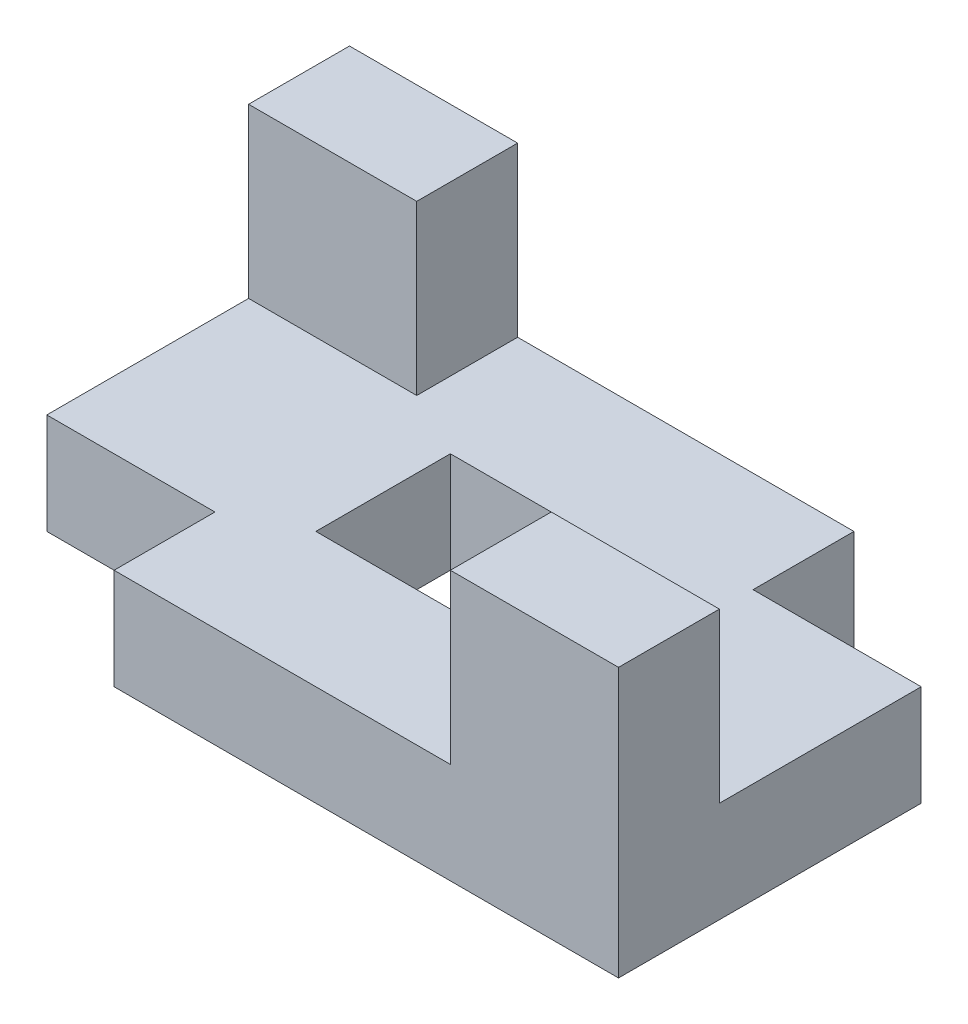
ISO-10303-21;
HEADER;
FILE_DESCRIPTION(('STEP AP214'),'2;1');
FILE_NAME('part.step','',(''),(''),'','','');
FILE_SCHEMA(('AUTOMOTIVE_DESIGN { 1 0 10303 214 1 1 1 1 }'));
ENDSEC;
DATA;
#1=APPLICATION_CONTEXT('core data for automotive mechanical design processes');
#2=APPLICATION_PROTOCOL_DEFINITION('international standard','automotive_design',2000,#1);
#3=PRODUCT_CONTEXT('',#1,'mechanical');
#4=PRODUCT('Part','Part','',(#3));
#5=PRODUCT_RELATED_PRODUCT_CATEGORY('part','',(#4));
#6=PRODUCT_DEFINITION_FORMATION('','',#4);
#7=PRODUCT_DEFINITION_CONTEXT('part definition',#1,'design');
#8=PRODUCT_DEFINITION('design','',#6,#7);
#9=PRODUCT_DEFINITION_SHAPE('','',#8);
#10=(LENGTH_UNIT() NAMED_UNIT(*) SI_UNIT(.MILLI.,.METRE.));
#11=(NAMED_UNIT(*) PLANE_ANGLE_UNIT() SI_UNIT($,.RADIAN.));
#12=(NAMED_UNIT(*) SI_UNIT($,.STERADIAN.) SOLID_ANGLE_UNIT());
#13=UNCERTAINTY_MEASURE_WITH_UNIT(LENGTH_MEASURE(1.E-05),#10,'distance_accuracy_value','');
#14=(GEOMETRIC_REPRESENTATION_CONTEXT(3) GLOBAL_UNCERTAINTY_ASSIGNED_CONTEXT((#13)) GLOBAL_UNIT_ASSIGNED_CONTEXT((#10,
#11,#12)) REPRESENTATION_CONTEXT('',''));
#15=CARTESIAN_POINT('',(0.,0.,0.));
#16=DIRECTION('',(0.,0.,1.));
#17=DIRECTION('',(1.,0.,0.));
#18=AXIS2_PLACEMENT_3D('',#15,#16,#17);
#19=CARTESIAN_POINT('',(0.,15.,0.));
#20=DIRECTION('',(0.,-1.,0.));
#21=DIRECTION('',(0.,0.,-1.));
#22=AXIS2_PLACEMENT_3D('',#19,#20,#21);
#23=PLANE('',#22);
#24=DIRECTION('',(1.,0.,0.));
#25=VECTOR('',#24,1.);
#26=CARTESIAN_POINT('',(-15.,15.,10.));
#27=LINE('',#26,#25);
#28=CARTESIAN_POINT('',(-15.,15.,10.));
#29=VERTEX_POINT('',#28);
#30=CARTESIAN_POINT('',(15.,15.,10.));
#31=VERTEX_POINT('',#30);
#32=EDGE_CURVE('E205',#29,#31,#27,.T.);
#33=ORIENTED_EDGE('',*,*,#32,.F.);
#34=DIRECTION('',(0.,0.,1.));
#35=VECTOR('',#34,1.);
#36=CARTESIAN_POINT('',(-15.,15.,-10.));
#37=LINE('',#36,#35);
#38=CARTESIAN_POINT('',(-15.,15.,-10.));
#39=VERTEX_POINT('',#38);
#40=EDGE_CURVE('E61',#39,#29,#37,.T.);
#41=ORIENTED_EDGE('',*,*,#40,.F.);
#42=DIRECTION('',(-1.,0.,0.));
#43=VECTOR('',#42,1.);
#44=CARTESIAN_POINT('',(-15.,15.,-10.));
#45=LINE('',#44,#43);
#46=CARTESIAN_POINT('',(15.,15.,-10.));
#47=VERTEX_POINT('',#46);
#48=EDGE_CURVE('E192',#47,#39,#45,.T.);
#49=ORIENTED_EDGE('',*,*,#48,.F.);
#50=DIRECTION('',(0.,0.,-1.));
#51=VECTOR('',#50,1.);
#52=CARTESIAN_POINT('',(15.,15.,-10.));
#53=LINE('',#52,#51);
#54=EDGE_CURVE('E196',#31,#47,#53,.T.);
#55=ORIENTED_EDGE('',*,*,#54,.F.);
#56=EDGE_LOOP('',(#33,#41,#49,#55));
#57=FACE_BOUND('',#56,.T.);
#58=DIRECTION('',(0.,0.,1.));
#59=VECTOR('',#58,1.);
#60=CARTESIAN_POINT('',(50.,15.,-30.));
#61=LINE('',#60,#59);
#62=CARTESIAN_POINT('',(50.,15.,-15.));
#63=VERTEX_POINT('',#62);
#64=CARTESIAN_POINT('',(50.,15.,15.));
#65=VERTEX_POINT('',#64);
#66=EDGE_CURVE('E340',#63,#65,#61,.T.);
#67=ORIENTED_EDGE('',*,*,#66,.F.);
#68=DIRECTION('',(1.,0.,0.));
#69=VECTOR('',#68,1.);
#70=CARTESIAN_POINT('',(50.,15.,-15.));
#71=LINE('',#70,#69);
#72=CARTESIAN_POINT('',(25.,15.,-15.));
#73=VERTEX_POINT('',#72);
#74=EDGE_CURVE('E225',#73,#63,#71,.T.);
#75=ORIENTED_EDGE('',*,*,#74,.F.);
#76=DIRECTION('',(0.,0.,1.));
#77=VECTOR('',#76,1.);
#78=CARTESIAN_POINT('',(25.,15.,-30.));
#79=LINE('',#78,#77);
#80=CARTESIAN_POINT('',(25.,15.,-30.));
#81=VERTEX_POINT('',#80);
#82=EDGE_CURVE('E214',#81,#73,#79,.T.);
#83=ORIENTED_EDGE('',*,*,#82,.F.);
#84=DIRECTION('',(1.,0.,0.));
#85=VECTOR('',#84,1.);
#86=CARTESIAN_POINT('',(-50.,15.,-30.));
#87=LINE('',#86,#85);
#88=CARTESIAN_POINT('',(-25.,15.,-30.));
#89=VERTEX_POINT('',#88);
#90=EDGE_CURVE('E344',#89,#81,#87,.T.);
#91=ORIENTED_EDGE('',*,*,#90,.F.);
#92=DIRECTION('',(0.,0.,1.));
#93=VECTOR('',#92,1.);
#94=CARTESIAN_POINT('',(-25.,15.,-30.));
#95=LINE('',#94,#93);
#96=CARTESIAN_POINT('',(-25.,15.,-15.));
#97=VERTEX_POINT('',#96);
#98=EDGE_CURVE('E296',#89,#97,#95,.T.);
#99=ORIENTED_EDGE('',*,*,#98,.T.);
#100=DIRECTION('',(1.,0.,0.));
#101=VECTOR('',#100,1.);
#102=CARTESIAN_POINT('',(-50.,15.,-15.));
#103=LINE('',#102,#101);
#104=CARTESIAN_POINT('',(-50.,15.,-15.));
#105=VERTEX_POINT('',#104);
#106=EDGE_CURVE('E309',#105,#97,#103,.T.);
#107=ORIENTED_EDGE('',*,*,#106,.F.);
#108=DIRECTION('',(0.,0.,1.));
#109=VECTOR('',#108,1.);
#110=CARTESIAN_POINT('',(-50.,15.,-30.));
#111=LINE('',#110,#109);
#112=CARTESIAN_POINT('',(-50.,15.,15.));
#113=VERTEX_POINT('',#112);
#114=EDGE_CURVE('E348',#105,#113,#111,.T.);
#115=ORIENTED_EDGE('',*,*,#114,.T.);
#116=DIRECTION('',(1.,0.,0.));
#117=VECTOR('',#116,1.);
#118=CARTESIAN_POINT('',(-50.,15.,15.));
#119=LINE('',#118,#117);
#120=CARTESIAN_POINT('',(-25.,15.,15.));
#121=VERTEX_POINT('',#120);
#122=EDGE_CURVE('E239',#113,#121,#119,.T.);
#123=ORIENTED_EDGE('',*,*,#122,.T.);
#124=DIRECTION('',(0.,0.,-1.));
#125=VECTOR('',#124,1.);
#126=CARTESIAN_POINT('',(-25.,15.,30.));
#127=LINE('',#126,#125);
#128=CARTESIAN_POINT('',(-25.,15.,30.));
#129=VERTEX_POINT('',#128);
#130=EDGE_CURVE('E250',#129,#121,#127,.T.);
#131=ORIENTED_EDGE('',*,*,#130,.F.);
#132=DIRECTION('',(1.,0.,0.));
#133=VECTOR('',#132,1.);
#134=CARTESIAN_POINT('',(-50.,15.,30.));
#135=LINE('',#134,#133);
#136=CARTESIAN_POINT('',(25.,15.,30.));
#137=VERTEX_POINT('',#136);
#138=EDGE_CURVE('E337',#129,#137,#135,.T.);
#139=ORIENTED_EDGE('',*,*,#138,.T.);
#140=DIRECTION('',(0.,0.,-1.));
#141=VECTOR('',#140,1.);
#142=CARTESIAN_POINT('',(25.,15.,30.));
#143=LINE('',#142,#141);
#144=CARTESIAN_POINT('',(25.,15.,15.));
#145=VERTEX_POINT('',#144);
#146=EDGE_CURVE('E270',#137,#145,#143,.T.);
#147=ORIENTED_EDGE('',*,*,#146,.T.);
#148=DIRECTION('',(-1.,0.,0.));
#149=VECTOR('',#148,1.);
#150=CARTESIAN_POINT('',(50.,15.,15.));
#151=LINE('',#150,#149);
#152=EDGE_CURVE('E276',#65,#145,#151,.T.);
#153=ORIENTED_EDGE('',*,*,#152,.F.);
#154=EDGE_LOOP('',(#67,#75,#83,#91,#99,#107,#115,#123,#131,#139,#147,#153));
#155=FACE_BOUND('',#154,.T.);
#156=ADVANCED_FACE('F45',(#57,#155),#23,.F.);
#157=CARTESIAN_POINT('',(-50.,15.,-30.));
#158=DIRECTION('',(1.,0.,0.));
#159=DIRECTION('',(0.,0.,-1.));
#160=AXIS2_PLACEMENT_3D('',#157,#158,#159);
#161=PLANE('',#160);
#162=DIRECTION('',(0.,1.,0.));
#163=VECTOR('',#162,1.);
#164=CARTESIAN_POINT('',(-50.,0.,15.));
#165=LINE('',#164,#163);
#166=CARTESIAN_POINT('',(-50.,0.,15.));
#167=VERTEX_POINT('',#166);
#168=EDGE_CURVE('E266',#167,#113,#165,.T.);
#169=ORIENTED_EDGE('',*,*,#168,.T.);
#170=ORIENTED_EDGE('',*,*,#114,.F.);
#171=DIRECTION('',(0.,-1.,0.));
#172=VECTOR('',#171,1.);
#173=CARTESIAN_POINT('',(-50.,40.,-15.));
#174=LINE('',#173,#172);
#175=CARTESIAN_POINT('',(-50.,40.,-15.));
#176=VERTEX_POINT('',#175);
#177=EDGE_CURVE('E325',#176,#105,#174,.T.);
#178=ORIENTED_EDGE('',*,*,#177,.F.);
#179=DIRECTION('',(0.,0.,1.));
#180=VECTOR('',#179,1.);
#181=CARTESIAN_POINT('',(-50.,40.,-30.));
#182=LINE('',#181,#180);
#183=CARTESIAN_POINT('',(-50.,40.,-30.));
#184=VERTEX_POINT('',#183);
#185=EDGE_CURVE('E316',#184,#176,#182,.T.);
#186=ORIENTED_EDGE('',*,*,#185,.F.);
#187=DIRECTION('',(0.,-1.,0.));
#188=VECTOR('',#187,1.);
#189=CARTESIAN_POINT('',(-50.,15.,-30.));
#190=LINE('',#189,#188);
#191=CARTESIAN_POINT('',(-50.,0.,-30.));
#192=VERTEX_POINT('',#191);
#193=EDGE_CURVE('E54',#184,#192,#190,.T.);
#194=ORIENTED_EDGE('',*,*,#193,.T.);
#195=DIRECTION('',(0.,0.,1.));
#196=VECTOR('',#195,1.);
#197=CARTESIAN_POINT('',(-50.,0.,-30.));
#198=LINE('',#197,#196);
#199=EDGE_CURVE('E341',#192,#167,#198,.T.);
#200=ORIENTED_EDGE('',*,*,#199,.T.);
#201=EDGE_LOOP('',(#169,#170,#178,#186,#194,#200));
#202=FACE_BOUND('',#201,.T.);
#203=ADVANCED_FACE('F368',(#202),#161,.F.);
#204=CARTESIAN_POINT('',(0.,0.,0.));
#205=DIRECTION('',(0.,-1.,0.));
#206=DIRECTION('',(0.,0.,-1.));
#207=AXIS2_PLACEMENT_3D('',#204,#205,#206);
#208=PLANE('',#207);
#209=DIRECTION('',(0.,0.,1.));
#210=VECTOR('',#209,1.);
#211=CARTESIAN_POINT('',(-15.,0.,-10.));
#212=LINE('',#211,#210);
#213=CARTESIAN_POINT('',(-15.,0.,-10.));
#214=VERTEX_POINT('',#213);
#215=CARTESIAN_POINT('',(-15.,0.,10.));
#216=VERTEX_POINT('',#215);
#217=EDGE_CURVE('E173',#214,#216,#212,.T.);
#218=ORIENTED_EDGE('',*,*,#217,.T.);
#219=DIRECTION('',(1.,0.,0.));
#220=VECTOR('',#219,1.);
#221=CARTESIAN_POINT('',(-15.,0.,10.));
#222=LINE('',#221,#220);
#223=CARTESIAN_POINT('',(15.,0.,10.));
#224=VERTEX_POINT('',#223);
#225=EDGE_CURVE('E183',#216,#224,#222,.T.);
#226=ORIENTED_EDGE('',*,*,#225,.T.);
#227=DIRECTION('',(0.,0.,-1.));
#228=VECTOR('',#227,1.);
#229=CARTESIAN_POINT('',(15.,0.,-10.));
#230=LINE('',#229,#228);
#231=CARTESIAN_POINT('',(15.,0.,-10.));
#232=VERTEX_POINT('',#231);
#233=EDGE_CURVE('E69',#224,#232,#230,.T.);
#234=ORIENTED_EDGE('',*,*,#233,.T.);
#235=DIRECTION('',(-1.,0.,0.));
#236=VECTOR('',#235,1.);
#237=CARTESIAN_POINT('',(-15.,0.,-10.));
#238=LINE('',#237,#236);
#239=EDGE_CURVE('E180',#232,#214,#238,.T.);
#240=ORIENTED_EDGE('',*,*,#239,.T.);
#241=EDGE_LOOP('',(#218,#226,#234,#240));
#242=FACE_BOUND('',#241,.T.);
#243=DIRECTION('',(1.,0.,0.));
#244=VECTOR('',#243,1.);
#245=CARTESIAN_POINT('',(50.,0.,-15.));
#246=LINE('',#245,#244);
#247=CARTESIAN_POINT('',(25.,0.,-15.));
#248=VERTEX_POINT('',#247);
#249=CARTESIAN_POINT('',(50.,0.,-15.));
#250=VERTEX_POINT('',#249);
#251=EDGE_CURVE('E224',#248,#250,#246,.T.);
#252=ORIENTED_EDGE('',*,*,#251,.T.);
#253=DIRECTION('',(0.,0.,1.));
#254=VECTOR('',#253,1.);
#255=CARTESIAN_POINT('',(50.,0.,-30.));
#256=LINE('',#255,#254);
#257=CARTESIAN_POINT('',(50.,0.,30.));
#258=VERTEX_POINT('',#257);
#259=EDGE_CURVE('E355',#250,#258,#256,.T.);
#260=ORIENTED_EDGE('',*,*,#259,.T.);
#261=DIRECTION('',(1.,0.,0.));
#262=VECTOR('',#261,1.);
#263=CARTESIAN_POINT('',(-50.,0.,30.));
#264=LINE('',#263,#262);
#265=CARTESIAN_POINT('',(-25.,0.,30.));
#266=VERTEX_POINT('',#265);
#267=EDGE_CURVE('E329',#266,#258,#264,.T.);
#268=ORIENTED_EDGE('',*,*,#267,.F.);
#269=DIRECTION('',(0.,0.,-1.));
#270=VECTOR('',#269,1.);
#271=CARTESIAN_POINT('',(-25.,0.,30.));
#272=LINE('',#271,#270);
#273=CARTESIAN_POINT('',(-25.,0.,15.));
#274=VERTEX_POINT('',#273);
#275=EDGE_CURVE('E249',#266,#274,#272,.T.);
#276=ORIENTED_EDGE('',*,*,#275,.T.);
#277=DIRECTION('',(1.,0.,0.));
#278=VECTOR('',#277,1.);
#279=CARTESIAN_POINT('',(-50.,0.,15.));
#280=LINE('',#279,#278);
#281=EDGE_CURVE('E245',#167,#274,#280,.T.);
#282=ORIENTED_EDGE('',*,*,#281,.F.);
#283=ORIENTED_EDGE('',*,*,#199,.F.);
#284=DIRECTION('',(1.,0.,0.));
#285=VECTOR('',#284,1.);
#286=CARTESIAN_POINT('',(-50.,0.,-30.));
#287=LINE('',#286,#285);
#288=CARTESIAN_POINT('',(25.,0.,-30.));
#289=VERTEX_POINT('',#288);
#290=EDGE_CURVE('E358',#192,#289,#287,.T.);
#291=ORIENTED_EDGE('',*,*,#290,.T.);
#292=DIRECTION('',(0.,0.,1.));
#293=VECTOR('',#292,1.);
#294=CARTESIAN_POINT('',(25.,0.,-30.));
#295=LINE('',#294,#293);
#296=EDGE_CURVE('E220',#289,#248,#295,.T.);
#297=ORIENTED_EDGE('',*,*,#296,.T.);
#298=EDGE_LOOP('',(#252,#260,#268,#276,#282,#283,#291,#297));
#299=FACE_BOUND('',#298,.T.);
#300=ADVANCED_FACE('F188',(#242,#299),#208,.T.);
#301=CARTESIAN_POINT('',(-50.,15.,30.));
#302=DIRECTION('',(0.,0.,-1.));
#303=DIRECTION('',(-1.,0.,0.));
#304=AXIS2_PLACEMENT_3D('',#301,#302,#303);
#305=PLANE('',#304);
#306=ORIENTED_EDGE('',*,*,#138,.F.);
#307=DIRECTION('',(0.,1.,0.));
#308=VECTOR('',#307,1.);
#309=CARTESIAN_POINT('',(-25.,0.,30.));
#310=LINE('',#309,#308);
#311=EDGE_CURVE('E254',#266,#129,#310,.T.);
#312=ORIENTED_EDGE('',*,*,#311,.F.);
#313=ORIENTED_EDGE('',*,*,#267,.T.);
#314=DIRECTION('',(0.,-1.,0.));
#315=VECTOR('',#314,1.);
#316=CARTESIAN_POINT('',(50.,15.,30.));
#317=LINE('',#316,#315);
#318=CARTESIAN_POINT('',(50.,40.,30.));
#319=VERTEX_POINT('',#318);
#320=EDGE_CURVE('E11',#319,#258,#317,.T.);
#321=ORIENTED_EDGE('',*,*,#320,.F.);
#322=DIRECTION('',(-1.,0.,0.));
#323=VECTOR('',#322,1.);
#324=CARTESIAN_POINT('',(50.,40.,30.));
#325=LINE('',#324,#323);
#326=CARTESIAN_POINT('',(25.,40.,30.));
#327=VERTEX_POINT('',#326);
#328=EDGE_CURVE('E271',#319,#327,#325,.T.);
#329=ORIENTED_EDGE('',*,*,#328,.T.);
#330=DIRECTION('',(0.,-1.,0.));
#331=VECTOR('',#330,1.);
#332=CARTESIAN_POINT('',(25.,40.,30.));
#333=LINE('',#332,#331);
#334=EDGE_CURVE('E286',#327,#137,#333,.T.);
#335=ORIENTED_EDGE('',*,*,#334,.T.);
#336=EDGE_LOOP('',(#306,#312,#313,#321,#329,#335));
#337=FACE_BOUND('',#336,.T.);
#338=ADVANCED_FACE('F47',(#337),#305,.F.);
#339=CARTESIAN_POINT('',(50.,15.,-30.));
#340=DIRECTION('',(1.,0.,0.));
#341=DIRECTION('',(0.,0.,-1.));
#342=AXIS2_PLACEMENT_3D('',#339,#340,#341);
#343=PLANE('',#342);
#344=DIRECTION('',(0.,1.,0.));
#345=VECTOR('',#344,1.);
#346=CARTESIAN_POINT('',(50.,0.,-15.));
#347=LINE('',#346,#345);
#348=EDGE_CURVE('E235',#250,#63,#347,.T.);
#349=ORIENTED_EDGE('',*,*,#348,.T.);
#350=ORIENTED_EDGE('',*,*,#66,.T.);
#351=DIRECTION('',(0.,-1.,0.));
#352=VECTOR('',#351,1.);
#353=CARTESIAN_POINT('',(50.,40.,15.));
#354=LINE('',#353,#352);
#355=CARTESIAN_POINT('',(50.,40.,15.));
#356=VERTEX_POINT('',#355);
#357=EDGE_CURVE('E292',#356,#65,#354,.T.);
#358=ORIENTED_EDGE('',*,*,#357,.F.);
#359=DIRECTION('',(0.,0.,-1.));
#360=VECTOR('',#359,1.);
#361=CARTESIAN_POINT('',(50.,40.,30.));
#362=LINE('',#361,#360);
#363=EDGE_CURVE('E283',#319,#356,#362,.T.);
#364=ORIENTED_EDGE('',*,*,#363,.F.);
#365=ORIENTED_EDGE('',*,*,#320,.T.);
#366=ORIENTED_EDGE('',*,*,#259,.F.);
#367=EDGE_LOOP('',(#349,#350,#358,#364,#365,#366));
#368=FACE_BOUND('',#367,.T.);
#369=ADVANCED_FACE('F388',(#368),#343,.T.);
#370=CARTESIAN_POINT('',(-50.,15.,-30.));
#371=DIRECTION('',(0.,0.,-1.));
#372=DIRECTION('',(-1.,0.,0.));
#373=AXIS2_PLACEMENT_3D('',#370,#371,#372);
#374=PLANE('',#373);
#375=DIRECTION('',(0.,1.,0.));
#376=VECTOR('',#375,1.);
#377=CARTESIAN_POINT('',(25.,0.,-30.));
#378=LINE('',#377,#376);
#379=EDGE_CURVE('E229',#289,#81,#378,.T.);
#380=ORIENTED_EDGE('',*,*,#379,.F.);
#381=ORIENTED_EDGE('',*,*,#290,.F.);
#382=ORIENTED_EDGE('',*,*,#193,.F.);
#383=DIRECTION('',(1.,0.,0.));
#384=VECTOR('',#383,1.);
#385=CARTESIAN_POINT('',(-50.,40.,-30.));
#386=LINE('',#385,#384);
#387=CARTESIAN_POINT('',(-25.,40.,-30.));
#388=VERTEX_POINT('',#387);
#389=EDGE_CURVE('E304',#184,#388,#386,.T.);
#390=ORIENTED_EDGE('',*,*,#389,.T.);
#391=DIRECTION('',(0.,-1.,0.));
#392=VECTOR('',#391,1.);
#393=CARTESIAN_POINT('',(-25.,40.,-30.));
#394=LINE('',#393,#392);
#395=EDGE_CURVE('E319',#388,#89,#394,.T.);
#396=ORIENTED_EDGE('',*,*,#395,.T.);
#397=ORIENTED_EDGE('',*,*,#90,.T.);
#398=EDGE_LOOP('',(#380,#381,#382,#390,#396,#397));
#399=FACE_BOUND('',#398,.T.);
#400=ADVANCED_FACE('F375',(#399),#374,.T.);
#401=CARTESIAN_POINT('',(-50.,40.,-15.));
#402=DIRECTION('',(0.,0.,-1.));
#403=DIRECTION('',(-1.,0.,0.));
#404=AXIS2_PLACEMENT_3D('',#401,#402,#403);
#405=PLANE('',#404);
#406=ORIENTED_EDGE('',*,*,#106,.T.);
#407=DIRECTION('',(0.,-1.,0.));
#408=VECTOR('',#407,1.);
#409=CARTESIAN_POINT('',(-25.,40.,-15.));
#410=LINE('',#409,#408);
#411=CARTESIAN_POINT('',(-25.,40.,-15.));
#412=VERTEX_POINT('',#411);
#413=EDGE_CURVE('E330',#412,#97,#410,.T.);
#414=ORIENTED_EDGE('',*,*,#413,.F.);
#415=DIRECTION('',(1.,0.,0.));
#416=VECTOR('',#415,1.);
#417=CARTESIAN_POINT('',(-50.,40.,-15.));
#418=LINE('',#417,#416);
#419=EDGE_CURVE('E313',#176,#412,#418,.T.);
#420=ORIENTED_EDGE('',*,*,#419,.F.);
#421=ORIENTED_EDGE('',*,*,#177,.T.);
#422=EDGE_LOOP('',(#406,#414,#420,#421));
#423=FACE_BOUND('',#422,.T.);
#424=ADVANCED_FACE('F403',(#423),#405,.F.);
#425=CARTESIAN_POINT('',(-25.,40.,-30.));
#426=DIRECTION('',(1.,0.,0.));
#427=DIRECTION('',(0.,0.,-1.));
#428=AXIS2_PLACEMENT_3D('',#425,#426,#427);
#429=PLANE('',#428);
#430=ORIENTED_EDGE('',*,*,#98,.F.);
#431=ORIENTED_EDGE('',*,*,#395,.F.);
#432=DIRECTION('',(0.,0.,1.));
#433=VECTOR('',#432,1.);
#434=CARTESIAN_POINT('',(-25.,40.,-30.));
#435=LINE('',#434,#433);
#436=EDGE_CURVE('E308',#388,#412,#435,.T.);
#437=ORIENTED_EDGE('',*,*,#436,.T.);
#438=ORIENTED_EDGE('',*,*,#413,.T.);
#439=EDGE_LOOP('',(#430,#431,#437,#438));
#440=FACE_BOUND('',#439,.T.);
#441=ADVANCED_FACE('F410',(#440),#429,.T.);
#442=CARTESIAN_POINT('',(0.,40.,0.));
#443=DIRECTION('',(0.,-1.,0.));
#444=DIRECTION('',(0.,0.,-1.));
#445=AXIS2_PLACEMENT_3D('',#442,#443,#444);
#446=PLANE('',#445);
#447=ORIENTED_EDGE('',*,*,#389,.F.);
#448=ORIENTED_EDGE('',*,*,#185,.T.);
#449=ORIENTED_EDGE('',*,*,#419,.T.);
#450=ORIENTED_EDGE('',*,*,#436,.F.);
#451=EDGE_LOOP('',(#447,#448,#449,#450));
#452=FACE_BOUND('',#451,.T.);
#453=ADVANCED_FACE('F407',(#452),#446,.F.);
#454=CARTESIAN_POINT('',(50.,40.,15.));
#455=DIRECTION('',(0.,0.,1.));
#456=DIRECTION('',(1.,0.,0.));
#457=AXIS2_PLACEMENT_3D('',#454,#455,#456);
#458=PLANE('',#457);
#459=ORIENTED_EDGE('',*,*,#152,.T.);
#460=DIRECTION('',(0.,-1.,0.));
#461=VECTOR('',#460,1.);
#462=CARTESIAN_POINT('',(25.,40.,15.));
#463=LINE('',#462,#461);
#464=CARTESIAN_POINT('',(25.,40.,15.));
#465=VERTEX_POINT('',#464);
#466=EDGE_CURVE('E297',#465,#145,#463,.T.);
#467=ORIENTED_EDGE('',*,*,#466,.F.);
#468=DIRECTION('',(-1.,0.,0.));
#469=VECTOR('',#468,1.);
#470=CARTESIAN_POINT('',(50.,40.,15.));
#471=LINE('',#470,#469);
#472=EDGE_CURVE('E280',#356,#465,#471,.T.);
#473=ORIENTED_EDGE('',*,*,#472,.F.);
#474=ORIENTED_EDGE('',*,*,#357,.T.);
#475=EDGE_LOOP('',(#459,#467,#473,#474));
#476=FACE_BOUND('',#475,.T.);
#477=ADVANCED_FACE('F417',(#476),#458,.F.);
#478=CARTESIAN_POINT('',(25.,40.,30.));
#479=DIRECTION('',(-1.,0.,0.));
#480=DIRECTION('',(0.,0.,1.));
#481=AXIS2_PLACEMENT_3D('',#478,#479,#480);
#482=PLANE('',#481);
#483=ORIENTED_EDGE('',*,*,#146,.F.);
#484=ORIENTED_EDGE('',*,*,#334,.F.);
#485=DIRECTION('',(0.,0.,-1.));
#486=VECTOR('',#485,1.);
#487=CARTESIAN_POINT('',(25.,40.,30.));
#488=LINE('',#487,#486);
#489=EDGE_CURVE('E275',#327,#465,#488,.T.);
#490=ORIENTED_EDGE('',*,*,#489,.T.);
#491=ORIENTED_EDGE('',*,*,#466,.T.);
#492=EDGE_LOOP('',(#483,#484,#490,#491));
#493=FACE_BOUND('',#492,.T.);
#494=ADVANCED_FACE('F513',(#493),#482,.T.);
#495=CARTESIAN_POINT('',(0.,40.,0.));
#496=DIRECTION('',(0.,-1.,0.));
#497=DIRECTION('',(0.,0.,-1.));
#498=AXIS2_PLACEMENT_3D('',#495,#496,#497);
#499=PLANE('',#498);
#500=ORIENTED_EDGE('',*,*,#328,.F.);
#501=ORIENTED_EDGE('',*,*,#363,.T.);
#502=ORIENTED_EDGE('',*,*,#472,.T.);
#503=ORIENTED_EDGE('',*,*,#489,.F.);
#504=EDGE_LOOP('',(#500,#501,#502,#503));
#505=FACE_BOUND('',#504,.T.);
#506=ADVANCED_FACE('F449',(#505),#499,.F.);
#507=CARTESIAN_POINT('',(-50.,0.,15.));
#508=DIRECTION('',(0.,0.,1.));
#509=DIRECTION('',(1.,0.,0.));
#510=AXIS2_PLACEMENT_3D('',#507,#508,#509);
#511=PLANE('',#510);
#512=ORIENTED_EDGE('',*,*,#122,.F.);
#513=ORIENTED_EDGE('',*,*,#168,.F.);
#514=ORIENTED_EDGE('',*,*,#281,.T.);
#515=DIRECTION('',(0.,1.,0.));
#516=VECTOR('',#515,1.);
#517=CARTESIAN_POINT('',(-25.,0.,15.));
#518=LINE('',#517,#516);
#519=EDGE_CURVE('E263',#274,#121,#518,.T.);
#520=ORIENTED_EDGE('',*,*,#519,.T.);
#521=EDGE_LOOP('',(#512,#513,#514,#520));
#522=FACE_BOUND('',#521,.T.);
#523=ADVANCED_FACE('F400',(#522),#511,.T.);
#524=CARTESIAN_POINT('',(-25.,0.,30.));
#525=DIRECTION('',(1.,0.,0.));
#526=DIRECTION('',(0.,0.,-1.));
#527=AXIS2_PLACEMENT_3D('',#524,#525,#526);
#528=PLANE('',#527);
#529=ORIENTED_EDGE('',*,*,#130,.T.);
#530=ORIENTED_EDGE('',*,*,#519,.F.);
#531=ORIENTED_EDGE('',*,*,#275,.F.);
#532=ORIENTED_EDGE('',*,*,#311,.T.);
#533=EDGE_LOOP('',(#529,#530,#531,#532));
#534=FACE_BOUND('',#533,.T.);
#535=ADVANCED_FACE('F397',(#534),#528,.F.);
#536=CARTESIAN_POINT('',(50.,0.,-15.));
#537=DIRECTION('',(0.,0.,1.));
#538=DIRECTION('',(1.,0.,0.));
#539=AXIS2_PLACEMENT_3D('',#536,#537,#538);
#540=PLANE('',#539);
#541=ORIENTED_EDGE('',*,*,#74,.T.);
#542=ORIENTED_EDGE('',*,*,#348,.F.);
#543=ORIENTED_EDGE('',*,*,#251,.F.);
#544=DIRECTION('',(0.,1.,0.));
#545=VECTOR('',#544,1.);
#546=CARTESIAN_POINT('',(25.,0.,-15.));
#547=LINE('',#546,#545);
#548=EDGE_CURVE('E240',#248,#73,#547,.T.);
#549=ORIENTED_EDGE('',*,*,#548,.T.);
#550=EDGE_LOOP('',(#541,#542,#543,#549));
#551=FACE_BOUND('',#550,.T.);
#552=ADVANCED_FACE('F384',(#551),#540,.F.);
#553=CARTESIAN_POINT('',(25.,0.,-30.));
#554=DIRECTION('',(-1.,0.,0.));
#555=DIRECTION('',(0.,0.,1.));
#556=AXIS2_PLACEMENT_3D('',#553,#554,#555);
#557=PLANE('',#556);
#558=ORIENTED_EDGE('',*,*,#82,.T.);
#559=ORIENTED_EDGE('',*,*,#548,.F.);
#560=ORIENTED_EDGE('',*,*,#296,.F.);
#561=ORIENTED_EDGE('',*,*,#379,.T.);
#562=EDGE_LOOP('',(#558,#559,#560,#561));
#563=FACE_BOUND('',#562,.T.);
#564=ADVANCED_FACE('F378',(#563),#557,.F.);
#565=CARTESIAN_POINT('',(-15.,0.,-10.));
#566=DIRECTION('',(-1.,0.,0.));
#567=DIRECTION('',(0.,0.,1.));
#568=AXIS2_PLACEMENT_3D('',#565,#566,#567);
#569=PLANE('',#568);
#570=ORIENTED_EDGE('',*,*,#40,.T.);
#571=DIRECTION('',(0.,1.,0.));
#572=VECTOR('',#571,1.);
#573=CARTESIAN_POINT('',(-15.,0.,10.));
#574=LINE('',#573,#572);
#575=EDGE_CURVE('E169',#216,#29,#574,.T.);
#576=ORIENTED_EDGE('',*,*,#575,.F.);
#577=ORIENTED_EDGE('',*,*,#217,.F.);
#578=DIRECTION('',(0.,1.,0.));
#579=VECTOR('',#578,1.);
#580=CARTESIAN_POINT('',(-15.,0.,-10.));
#581=LINE('',#580,#579);
#582=EDGE_CURVE('E211',#214,#39,#581,.T.);
#583=ORIENTED_EDGE('',*,*,#582,.T.);
#584=EDGE_LOOP('',(#570,#576,#577,#583));
#585=FACE_BOUND('',#584,.T.);
#586=ADVANCED_FACE('F171',(#585),#569,.F.);
#587=CARTESIAN_POINT('',(-15.,0.,-10.));
#588=DIRECTION('',(0.,0.,-1.));
#589=DIRECTION('',(-1.,0.,0.));
#590=AXIS2_PLACEMENT_3D('',#587,#588,#589);
#591=PLANE('',#590);
#592=ORIENTED_EDGE('',*,*,#48,.T.);
#593=ORIENTED_EDGE('',*,*,#582,.F.);
#594=ORIENTED_EDGE('',*,*,#239,.F.);
#595=DIRECTION('',(0.,1.,0.));
#596=VECTOR('',#595,1.);
#597=CARTESIAN_POINT('',(15.,0.,-10.));
#598=LINE('',#597,#596);
#599=EDGE_CURVE('E215',#232,#47,#598,.T.);
#600=ORIENTED_EDGE('',*,*,#599,.T.);
#601=EDGE_LOOP('',(#592,#593,#594,#600));
#602=FACE_BOUND('',#601,.T.);
#603=ADVANCED_FACE('F482',(#602),#591,.F.);
#604=CARTESIAN_POINT('',(15.,0.,-10.));
#605=DIRECTION('',(1.,0.,0.));
#606=DIRECTION('',(0.,0.,-1.));
#607=AXIS2_PLACEMENT_3D('',#604,#605,#606);
#608=PLANE('',#607);
#609=ORIENTED_EDGE('',*,*,#54,.T.);
#610=ORIENTED_EDGE('',*,*,#599,.F.);
#611=ORIENTED_EDGE('',*,*,#233,.F.);
#612=DIRECTION('',(0.,1.,0.));
#613=VECTOR('',#612,1.);
#614=CARTESIAN_POINT('',(15.,0.,10.));
#615=LINE('',#614,#613);
#616=EDGE_CURVE('E179',#224,#31,#615,.T.);
#617=ORIENTED_EDGE('',*,*,#616,.T.);
#618=EDGE_LOOP('',(#609,#610,#611,#617));
#619=FACE_BOUND('',#618,.T.);
#620=ADVANCED_FACE('F491',(#619),#608,.F.);
#621=CARTESIAN_POINT('',(-15.,0.,10.));
#622=DIRECTION('',(0.,0.,1.));
#623=DIRECTION('',(1.,0.,0.));
#624=AXIS2_PLACEMENT_3D('',#621,#622,#623);
#625=PLANE('',#624);
#626=ORIENTED_EDGE('',*,*,#32,.T.);
#627=ORIENTED_EDGE('',*,*,#616,.F.);
#628=ORIENTED_EDGE('',*,*,#225,.F.);
#629=ORIENTED_EDGE('',*,*,#575,.T.);
#630=EDGE_LOOP('',(#626,#627,#628,#629));
#631=FACE_BOUND('',#630,.T.);
#632=ADVANCED_FACE('F184',(#631),#625,.F.);
#633=CLOSED_SHELL('',(#156,#203,#300,#338,#369,#400,#424,#441,#453,#477,#494,#506,#523,#535,
#552,#564,#586,#603,#620,#632));
#634=MANIFOLD_SOLID_BREP('B2',#633);
#635=ADVANCED_BREP_SHAPE_REPRESENTATION('',(#18,#634),#14);
#636=SHAPE_DEFINITION_REPRESENTATION(#9,#635);
ENDSEC;
END-ISO-10303-21;
